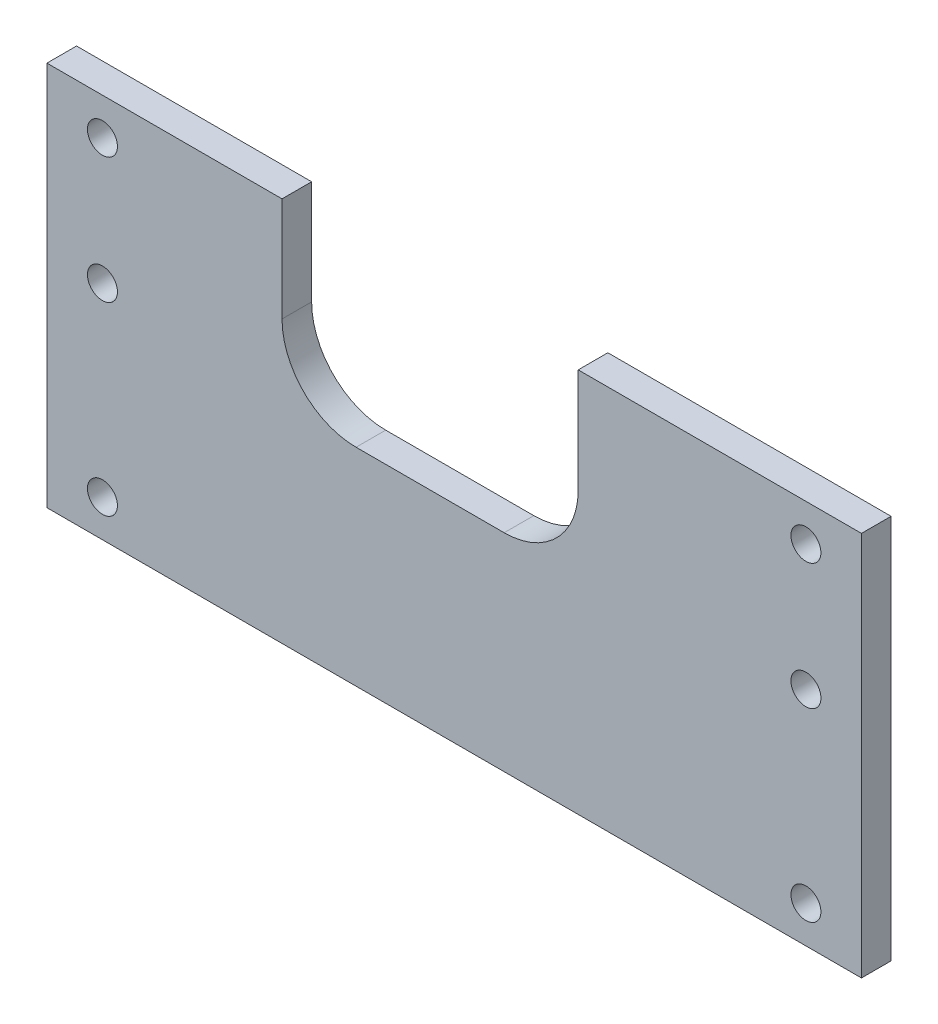
ISO-10303-21;
HEADER;
FILE_DESCRIPTION(('STEP AP214'),'2;1');
FILE_NAME('part.step','',(''),(''),'','','');
FILE_SCHEMA(('AUTOMOTIVE_DESIGN { 1 0 10303 214 1 1 1 1 }'));
ENDSEC;
DATA;
#1=APPLICATION_CONTEXT('core data for automotive mechanical design processes');
#2=APPLICATION_PROTOCOL_DEFINITION('international standard','automotive_design',2000,#1);
#3=PRODUCT_CONTEXT('',#1,'mechanical');
#4=PRODUCT('Part','Part','',(#3));
#5=PRODUCT_RELATED_PRODUCT_CATEGORY('part','',(#4));
#6=PRODUCT_DEFINITION_FORMATION('','',#4);
#7=PRODUCT_DEFINITION_CONTEXT('part definition',#1,'design');
#8=PRODUCT_DEFINITION('design','',#6,#7);
#9=PRODUCT_DEFINITION_SHAPE('','',#8);
#10=(LENGTH_UNIT() NAMED_UNIT(*) SI_UNIT(.MILLI.,.METRE.));
#11=(NAMED_UNIT(*) PLANE_ANGLE_UNIT() SI_UNIT($,.RADIAN.));
#12=(NAMED_UNIT(*) SI_UNIT($,.STERADIAN.) SOLID_ANGLE_UNIT());
#13=UNCERTAINTY_MEASURE_WITH_UNIT(LENGTH_MEASURE(1.E-05),#10,'distance_accuracy_value','');
#14=(GEOMETRIC_REPRESENTATION_CONTEXT(3) GLOBAL_UNCERTAINTY_ASSIGNED_CONTEXT((#13)) GLOBAL_UNIT_ASSIGNED_CONTEXT((#10,
#11,#12)) REPRESENTATION_CONTEXT('',''));
#15=CARTESIAN_POINT('',(0.,0.,0.));
#16=DIRECTION('',(0.,0.,1.));
#17=DIRECTION('',(1.,0.,0.));
#18=AXIS2_PLACEMENT_3D('',#15,#16,#17);
#19=CARTESIAN_POINT('',(-55.,26.,4.));
#20=DIRECTION('',(0.,-1.,0.));
#21=DIRECTION('',(0.,0.,-1.));
#22=AXIS2_PLACEMENT_3D('',#19,#20,#21);
#23=PLANE('',#22);
#24=DIRECTION('',(-1.,0.,0.));
#25=VECTOR('',#24,1.);
#26=CARTESIAN_POINT('',(-55.,26.,4.));
#27=LINE('',#26,#25);
#28=CARTESIAN_POINT('',(-23.2499931858945,26.,4.));
#29=VERTEX_POINT('',#28);
#30=CARTESIAN_POINT('',(-55.,26.,4.));
#31=VERTEX_POINT('',#30);
#32=EDGE_CURVE('E131',#29,#31,#27,.T.);
#33=ORIENTED_EDGE('',*,*,#32,.F.);
#34=DIRECTION('',(0.,0.,-1.));
#35=VECTOR('',#34,1.);
#36=CARTESIAN_POINT('',(-23.2499931858945,26.,4.));
#37=LINE('',#36,#35);
#38=CARTESIAN_POINT('',(-23.2499931858945,26.,0.));
#39=VERTEX_POINT('',#38);
#40=EDGE_CURVE('E124',#29,#39,#37,.T.);
#41=ORIENTED_EDGE('',*,*,#40,.T.);
#42=DIRECTION('',(-1.,0.,0.));
#43=VECTOR('',#42,1.);
#44=CARTESIAN_POINT('',(-55.,26.,0.));
#45=LINE('',#44,#43);
#46=CARTESIAN_POINT('',(-55.,26.,0.));
#47=VERTEX_POINT('',#46);
#48=EDGE_CURVE('E143',#39,#47,#45,.T.);
#49=ORIENTED_EDGE('',*,*,#48,.T.);
#50=DIRECTION('',(0.,0.,-1.));
#51=VECTOR('',#50,1.);
#52=CARTESIAN_POINT('',(-55.,26.,4.));
#53=LINE('',#52,#51);
#54=EDGE_CURVE('E155',#31,#47,#53,.T.);
#55=ORIENTED_EDGE('',*,*,#54,.F.);
#56=EDGE_LOOP('',(#33,#41,#49,#55));
#57=FACE_BOUND('',#56,.T.);
#58=ADVANCED_FACE('F34',(#57),#23,.F.);
#59=CARTESIAN_POINT('',(55.,-26.,4.));
#60=DIRECTION('',(-1.,0.,0.));
#61=DIRECTION('',(0.,0.,1.));
#62=AXIS2_PLACEMENT_3D('',#59,#60,#61);
#63=PLANE('',#62);
#64=DIRECTION('',(0.,1.,0.));
#65=VECTOR('',#64,1.);
#66=CARTESIAN_POINT('',(55.,-26.,0.));
#67=LINE('',#66,#65);
#68=CARTESIAN_POINT('',(55.,-26.,0.));
#69=VERTEX_POINT('',#68);
#70=CARTESIAN_POINT('',(55.,26.,0.));
#71=VERTEX_POINT('',#70);
#72=EDGE_CURVE('E140',#69,#71,#67,.T.);
#73=ORIENTED_EDGE('',*,*,#72,.T.);
#74=DIRECTION('',(0.,0.,-1.));
#75=VECTOR('',#74,1.);
#76=CARTESIAN_POINT('',(55.,26.,4.));
#77=LINE('',#76,#75);
#78=CARTESIAN_POINT('',(55.,26.,4.));
#79=VERTEX_POINT('',#78);
#80=EDGE_CURVE('E158',#79,#71,#77,.T.);
#81=ORIENTED_EDGE('',*,*,#80,.F.);
#82=DIRECTION('',(0.,1.,0.));
#83=VECTOR('',#82,1.);
#84=CARTESIAN_POINT('',(55.,-26.,4.));
#85=LINE('',#84,#83);
#86=CARTESIAN_POINT('',(55.,-26.,4.));
#87=VERTEX_POINT('',#86);
#88=EDGE_CURVE('E128',#87,#79,#85,.T.);
#89=ORIENTED_EDGE('',*,*,#88,.F.);
#90=DIRECTION('',(0.,0.,-1.));
#91=VECTOR('',#90,1.);
#92=CARTESIAN_POINT('',(55.,-26.,4.));
#93=LINE('',#92,#91);
#94=EDGE_CURVE('E139',#87,#69,#93,.T.);
#95=ORIENTED_EDGE('',*,*,#94,.T.);
#96=EDGE_LOOP('',(#73,#81,#89,#95));
#97=FACE_BOUND('',#96,.T.);
#98=ADVANCED_FACE('F255',(#97),#63,.F.);
#99=CARTESIAN_POINT('',(16.7500000000001,26.,0.));
#100=VERTEX_POINT('',#99);
#101=EDGE_CURVE('E123',#71,#100,#45,.T.);
#102=ORIENTED_EDGE('',*,*,#101,.T.);
#103=DIRECTION('',(0.,0.,1.));
#104=VECTOR('',#103,1.);
#105=CARTESIAN_POINT('',(16.7500000000001,26.,4.));
#106=LINE('',#105,#104);
#107=CARTESIAN_POINT('',(16.7500000000001,26.,4.));
#108=VERTEX_POINT('',#107);
#109=EDGE_CURVE('E110',#100,#108,#106,.T.);
#110=ORIENTED_EDGE('',*,*,#109,.T.);
#111=EDGE_CURVE('E121',#79,#108,#27,.T.);
#112=ORIENTED_EDGE('',*,*,#111,.F.);
#113=ORIENTED_EDGE('',*,*,#80,.T.);
#114=EDGE_LOOP('',(#102,#110,#112,#113));
#115=FACE_BOUND('',#114,.T.);
#116=ADVANCED_FACE('F119',(#115),#23,.F.);
#117=CARTESIAN_POINT('',(-55.,-26.,4.));
#118=DIRECTION('',(1.,0.,0.));
#119=DIRECTION('',(0.,0.,-1.));
#120=AXIS2_PLACEMENT_3D('',#117,#118,#119);
#121=PLANE('',#120);
#122=DIRECTION('',(0.,-1.,0.));
#123=VECTOR('',#122,1.);
#124=CARTESIAN_POINT('',(-55.,-26.,0.));
#125=LINE('',#124,#123);
#126=CARTESIAN_POINT('',(-55.,-26.,0.));
#127=VERTEX_POINT('',#126);
#128=EDGE_CURVE('E146',#47,#127,#125,.T.);
#129=ORIENTED_EDGE('',*,*,#128,.T.);
#130=DIRECTION('',(0.,0.,-1.));
#131=VECTOR('',#130,1.);
#132=CARTESIAN_POINT('',(-55.,-26.,4.));
#133=LINE('',#132,#131);
#134=CARTESIAN_POINT('',(-55.,-26.,4.));
#135=VERTEX_POINT('',#134);
#136=EDGE_CURVE('E152',#135,#127,#133,.T.);
#137=ORIENTED_EDGE('',*,*,#136,.F.);
#138=DIRECTION('',(0.,-1.,0.));
#139=VECTOR('',#138,1.);
#140=CARTESIAN_POINT('',(-55.,-26.,4.));
#141=LINE('',#140,#139);
#142=EDGE_CURVE('E130',#31,#135,#141,.T.);
#143=ORIENTED_EDGE('',*,*,#142,.F.);
#144=ORIENTED_EDGE('',*,*,#54,.T.);
#145=EDGE_LOOP('',(#129,#137,#143,#144));
#146=FACE_BOUND('',#145,.T.);
#147=ADVANCED_FACE('F266',(#146),#121,.F.);
#148=CARTESIAN_POINT('',(-55.,-26.,4.));
#149=DIRECTION('',(0.,1.,0.));
#150=DIRECTION('',(0.,0.,1.));
#151=AXIS2_PLACEMENT_3D('',#148,#149,#150);
#152=PLANE('',#151);
#153=DIRECTION('',(1.,0.,0.));
#154=VECTOR('',#153,1.);
#155=CARTESIAN_POINT('',(-55.,-26.,0.));
#156=LINE('',#155,#154);
#157=EDGE_CURVE('E148',#127,#69,#156,.T.);
#158=ORIENTED_EDGE('',*,*,#157,.T.);
#159=ORIENTED_EDGE('',*,*,#94,.F.);
#160=DIRECTION('',(1.,0.,0.));
#161=VECTOR('',#160,1.);
#162=CARTESIAN_POINT('',(-55.,-26.,4.));
#163=LINE('',#162,#161);
#164=EDGE_CURVE('E133',#135,#87,#163,.T.);
#165=ORIENTED_EDGE('',*,*,#164,.F.);
#166=ORIENTED_EDGE('',*,*,#136,.T.);
#167=EDGE_LOOP('',(#158,#159,#165,#166));
#168=FACE_BOUND('',#167,.T.);
#169=ADVANCED_FACE('F250',(#168),#152,.F.);
#170=CARTESIAN_POINT('',(0.,0.,4.));
#171=DIRECTION('',(0.,0.,-1.));
#172=DIRECTION('',(-1.,0.,0.));
#173=AXIS2_PLACEMENT_3D('',#170,#171,#172);
#174=PLANE('',#173);
#175=CARTESIAN_POINT('',(-47.5,21.0000000000086,4.));
#176=DIRECTION('',(0.,0.,-1.));
#177=DIRECTION('',(1.,0.,0.));
#178=AXIS2_PLACEMENT_3D('',#175,#176,#177);
#179=CIRCLE('',#178,2.025);
#180=CARTESIAN_POINT('',(-45.475,21.0000000000086,4.));
#181=VERTEX_POINT('',#180);
#182=EDGE_CURVE('E229',#181,#181,#179,.T.);
#183=ORIENTED_EDGE('',*,*,#182,.T.);
#184=EDGE_LOOP('',(#183));
#185=FACE_BOUND('',#184,.T.);
#186=CARTESIAN_POINT('',(-47.5,4.00000000000361,4.));
#187=DIRECTION('',(0.,0.,-1.));
#188=DIRECTION('',(1.,0.,0.));
#189=AXIS2_PLACEMENT_3D('',#186,#187,#188);
#190=CIRCLE('',#189,2.025);
#191=CARTESIAN_POINT('',(-45.475,4.00000000000361,4.));
#192=VERTEX_POINT('',#191);
#193=EDGE_CURVE('E223',#192,#192,#190,.T.);
#194=ORIENTED_EDGE('',*,*,#193,.T.);
#195=EDGE_LOOP('',(#194));
#196=FACE_BOUND('',#195,.T.);
#197=CARTESIAN_POINT('',(-47.5,-21.0000000000014,4.));
#198=DIRECTION('',(0.,0.,-1.));
#199=DIRECTION('',(1.,0.,0.));
#200=AXIS2_PLACEMENT_3D('',#197,#198,#199);
#201=CIRCLE('',#200,2.025);
#202=CARTESIAN_POINT('',(-45.475,-21.0000000000014,4.));
#203=VERTEX_POINT('',#202);
#204=EDGE_CURVE('E217',#203,#203,#201,.T.);
#205=ORIENTED_EDGE('',*,*,#204,.T.);
#206=EDGE_LOOP('',(#205));
#207=FACE_BOUND('',#206,.T.);
#208=CARTESIAN_POINT('',(47.5,-21.0000000000014,4.));
#209=DIRECTION('',(0.,0.,-1.));
#210=DIRECTION('',(-1.,0.,0.));
#211=AXIS2_PLACEMENT_3D('',#208,#209,#210);
#212=CIRCLE('',#211,2.025);
#213=CARTESIAN_POINT('',(45.475,-21.0000000000014,4.));
#214=VERTEX_POINT('',#213);
#215=EDGE_CURVE('E211',#214,#214,#212,.T.);
#216=ORIENTED_EDGE('',*,*,#215,.T.);
#217=EDGE_LOOP('',(#216));
#218=FACE_BOUND('',#217,.T.);
#219=CARTESIAN_POINT('',(47.5,4.00000000000361,4.));
#220=DIRECTION('',(0.,0.,-1.));
#221=DIRECTION('',(-1.,0.,0.));
#222=AXIS2_PLACEMENT_3D('',#219,#220,#221);
#223=CIRCLE('',#222,2.025);
#224=CARTESIAN_POINT('',(45.475,4.00000000000361,4.));
#225=VERTEX_POINT('',#224);
#226=EDGE_CURVE('E204',#225,#225,#223,.T.);
#227=ORIENTED_EDGE('',*,*,#226,.T.);
#228=EDGE_LOOP('',(#227));
#229=FACE_BOUND('',#228,.T.);
#230=CARTESIAN_POINT('',(47.5,21.0000000000086,4.));
#231=DIRECTION('',(0.,0.,-1.));
#232=DIRECTION('',(-1.,0.,0.));
#233=AXIS2_PLACEMENT_3D('',#230,#231,#232);
#234=CIRCLE('',#233,2.025);
#235=CARTESIAN_POINT('',(45.475,21.0000000000086,4.));
#236=VERTEX_POINT('',#235);
#237=EDGE_CURVE('E144',#236,#236,#234,.T.);
#238=ORIENTED_EDGE('',*,*,#237,.T.);
#239=EDGE_LOOP('',(#238));
#240=FACE_BOUND('',#239,.T.);
#241=DIRECTION('',(0.,-1.,0.));
#242=VECTOR('',#241,1.);
#243=CARTESIAN_POINT('',(16.7500000000001,1.94999999999883,4.));
#244=LINE('',#243,#242);
#245=CARTESIAN_POINT('',(16.7500000000001,11.9499999999988,4.));
#246=VERTEX_POINT('',#245);
#247=EDGE_CURVE('E107',#108,#246,#244,.T.);
#248=ORIENTED_EDGE('',*,*,#247,.T.);
#249=CARTESIAN_POINT('',(6.75000000000007,11.9499999999988,4.));
#250=DIRECTION('',(0.,0.,-1.));
#251=DIRECTION('',(-1.,0.,0.));
#252=AXIS2_PLACEMENT_3D('',#249,#250,#251);
#253=CIRCLE('',#252,10.);
#254=CARTESIAN_POINT('',(6.75000000000007,1.94999999999883,4.));
#255=VERTEX_POINT('',#254);
#256=EDGE_CURVE('E11',#246,#255,#253,.T.);
#257=ORIENTED_EDGE('',*,*,#256,.T.);
#258=DIRECTION('',(-1.,0.,0.));
#259=VECTOR('',#258,1.);
#260=CARTESIAN_POINT('',(16.7500000000001,1.94999999999883,4.));
#261=LINE('',#260,#259);
#262=CARTESIAN_POINT('',(-13.2499931858945,1.94999999999883,4.));
#263=VERTEX_POINT('',#262);
#264=EDGE_CURVE('E114',#255,#263,#261,.T.);
#265=ORIENTED_EDGE('',*,*,#264,.T.);
#266=CARTESIAN_POINT('',(-13.2499931858945,11.9499999999988,4.));
#267=DIRECTION('',(0.,0.,-1.));
#268=DIRECTION('',(-1.,0.,0.));
#269=AXIS2_PLACEMENT_3D('',#266,#267,#268);
#270=CIRCLE('',#269,10.);
#271=CARTESIAN_POINT('',(-23.2499931858945,11.9499999999988,4.));
#272=VERTEX_POINT('',#271);
#273=EDGE_CURVE('E173',#263,#272,#270,.T.);
#274=ORIENTED_EDGE('',*,*,#273,.T.);
#275=DIRECTION('',(0.,1.,0.));
#276=VECTOR('',#275,1.);
#277=CARTESIAN_POINT('',(-23.2499931858945,1.94999999999883,4.));
#278=LINE('',#277,#276);
#279=EDGE_CURVE('E115',#272,#29,#278,.T.);
#280=ORIENTED_EDGE('',*,*,#279,.T.);
#281=ORIENTED_EDGE('',*,*,#32,.T.);
#282=ORIENTED_EDGE('',*,*,#142,.T.);
#283=ORIENTED_EDGE('',*,*,#164,.T.);
#284=ORIENTED_EDGE('',*,*,#88,.T.);
#285=ORIENTED_EDGE('',*,*,#111,.T.);
#286=EDGE_LOOP('',(#248,#257,#265,#274,#280,#281,#282,#283,#284,#285));
#287=FACE_BOUND('',#286,.T.);
#288=ADVANCED_FACE('F126',(#185,#196,#207,#218,#229,#240,#287),#174,.F.);
#289=CARTESIAN_POINT('',(0.,0.,0.));
#290=DIRECTION('',(0.,0.,-1.));
#291=DIRECTION('',(-1.,0.,0.));
#292=AXIS2_PLACEMENT_3D('',#289,#290,#291);
#293=PLANE('',#292);
#294=DIRECTION('',(0.,1.,0.));
#295=VECTOR('',#294,1.);
#296=CARTESIAN_POINT('',(-23.2499931858945,1.94999999999883,0.));
#297=LINE('',#296,#295);
#298=CARTESIAN_POINT('',(-23.2499931858945,11.9499999999988,0.));
#299=VERTEX_POINT('',#298);
#300=EDGE_CURVE('E194',#299,#39,#297,.T.);
#301=ORIENTED_EDGE('',*,*,#300,.F.);
#302=CARTESIAN_POINT('',(-13.2499931858945,11.9499999999988,0.));
#303=DIRECTION('',(0.,0.,-1.));
#304=DIRECTION('',(-1.,0.,0.));
#305=AXIS2_PLACEMENT_3D('',#302,#303,#304);
#306=CIRCLE('',#305,10.);
#307=CARTESIAN_POINT('',(-13.2499931858945,1.94999999999883,0.));
#308=VERTEX_POINT('',#307);
#309=EDGE_CURVE('E171',#299,#308,#306,.F.);
#310=ORIENTED_EDGE('',*,*,#309,.T.);
#311=DIRECTION('',(-1.,0.,0.));
#312=VECTOR('',#311,1.);
#313=CARTESIAN_POINT('',(16.7500000000001,1.94999999999883,0.));
#314=LINE('',#313,#312);
#315=CARTESIAN_POINT('',(6.75000000000007,1.94999999999883,0.));
#316=VERTEX_POINT('',#315);
#317=EDGE_CURVE('E187',#316,#308,#314,.T.);
#318=ORIENTED_EDGE('',*,*,#317,.F.);
#319=CARTESIAN_POINT('',(6.75000000000007,11.9499999999988,0.));
#320=DIRECTION('',(0.,0.,-1.));
#321=DIRECTION('',(-1.,0.,0.));
#322=AXIS2_PLACEMENT_3D('',#319,#320,#321);
#323=CIRCLE('',#322,10.);
#324=CARTESIAN_POINT('',(16.7500000000001,11.9499999999988,0.));
#325=VERTEX_POINT('',#324);
#326=EDGE_CURVE('E42',#316,#325,#323,.F.);
#327=ORIENTED_EDGE('',*,*,#326,.T.);
#328=DIRECTION('',(0.,-1.,0.));
#329=VECTOR('',#328,1.);
#330=CARTESIAN_POINT('',(16.7500000000001,0.,0.));
#331=LINE('',#330,#329);
#332=EDGE_CURVE('E160',#100,#325,#331,.T.);
#333=ORIENTED_EDGE('',*,*,#332,.F.);
#334=ORIENTED_EDGE('',*,*,#101,.F.);
#335=ORIENTED_EDGE('',*,*,#72,.F.);
#336=ORIENTED_EDGE('',*,*,#157,.F.);
#337=ORIENTED_EDGE('',*,*,#128,.F.);
#338=ORIENTED_EDGE('',*,*,#48,.F.);
#339=EDGE_LOOP('',(#301,#310,#318,#327,#333,#334,#335,#336,#337,#338));
#340=FACE_BOUND('',#339,.T.);
#341=CARTESIAN_POINT('',(-47.5,21.0000000000086,0.));
#342=DIRECTION('',(0.,0.,-1.));
#343=DIRECTION('',(1.,0.,0.));
#344=AXIS2_PLACEMENT_3D('',#341,#342,#343);
#345=CIRCLE('',#344,2.025);
#346=CARTESIAN_POINT('',(-45.475,21.0000000000086,0.));
#347=VERTEX_POINT('',#346);
#348=EDGE_CURVE('E203',#347,#347,#345,.T.);
#349=ORIENTED_EDGE('',*,*,#348,.F.);
#350=EDGE_LOOP('',(#349));
#351=FACE_BOUND('',#350,.T.);
#352=CARTESIAN_POINT('',(-47.5,4.00000000000361,0.));
#353=DIRECTION('',(0.,0.,-1.));
#354=DIRECTION('',(1.,0.,0.));
#355=AXIS2_PLACEMENT_3D('',#352,#353,#354);
#356=CIRCLE('',#355,2.025);
#357=CARTESIAN_POINT('',(-45.475,4.00000000000361,0.));
#358=VERTEX_POINT('',#357);
#359=EDGE_CURVE('E226',#358,#358,#356,.T.);
#360=ORIENTED_EDGE('',*,*,#359,.F.);
#361=EDGE_LOOP('',(#360));
#362=FACE_BOUND('',#361,.T.);
#363=CARTESIAN_POINT('',(-47.5,-21.0000000000014,0.));
#364=DIRECTION('',(0.,0.,-1.));
#365=DIRECTION('',(1.,0.,0.));
#366=AXIS2_PLACEMENT_3D('',#363,#364,#365);
#367=CIRCLE('',#366,2.025);
#368=CARTESIAN_POINT('',(-45.475,-21.0000000000014,0.));
#369=VERTEX_POINT('',#368);
#370=EDGE_CURVE('E220',#369,#369,#367,.T.);
#371=ORIENTED_EDGE('',*,*,#370,.F.);
#372=EDGE_LOOP('',(#371));
#373=FACE_BOUND('',#372,.T.);
#374=CARTESIAN_POINT('',(47.5,-21.0000000000014,0.));
#375=DIRECTION('',(0.,0.,-1.));
#376=DIRECTION('',(-1.,0.,0.));
#377=AXIS2_PLACEMENT_3D('',#374,#375,#376);
#378=CIRCLE('',#377,2.025);
#379=CARTESIAN_POINT('',(45.475,-21.0000000000014,0.));
#380=VERTEX_POINT('',#379);
#381=EDGE_CURVE('E214',#380,#380,#378,.T.);
#382=ORIENTED_EDGE('',*,*,#381,.F.);
#383=EDGE_LOOP('',(#382));
#384=FACE_BOUND('',#383,.T.);
#385=CARTESIAN_POINT('',(47.5,4.00000000000361,0.));
#386=DIRECTION('',(0.,0.,-1.));
#387=DIRECTION('',(-1.,0.,0.));
#388=AXIS2_PLACEMENT_3D('',#385,#386,#387);
#389=CIRCLE('',#388,2.025);
#390=CARTESIAN_POINT('',(45.475,4.00000000000361,0.));
#391=VERTEX_POINT('',#390);
#392=EDGE_CURVE('E208',#391,#391,#389,.T.);
#393=ORIENTED_EDGE('',*,*,#392,.F.);
#394=EDGE_LOOP('',(#393));
#395=FACE_BOUND('',#394,.T.);
#396=CARTESIAN_POINT('',(47.5,21.0000000000086,0.));
#397=DIRECTION('',(0.,0.,-1.));
#398=DIRECTION('',(-1.,0.,0.));
#399=AXIS2_PLACEMENT_3D('',#396,#397,#398);
#400=CIRCLE('',#399,2.025);
#401=CARTESIAN_POINT('',(45.475,21.0000000000086,0.));
#402=VERTEX_POINT('',#401);
#403=EDGE_CURVE('E207',#402,#402,#400,.T.);
#404=ORIENTED_EDGE('',*,*,#403,.F.);
#405=EDGE_LOOP('',(#404));
#406=FACE_BOUND('',#405,.T.);
#407=ADVANCED_FACE('F191',(#340,#351,#362,#373,#384,#395,#406),#293,.T.);
#408=CARTESIAN_POINT('',(47.5,21.0000000000086,4.));
#409=DIRECTION('',(0.,0.,-1.));
#410=DIRECTION('',(-1.,0.,0.));
#411=AXIS2_PLACEMENT_3D('',#408,#409,#410);
#412=CYLINDRICAL_SURFACE('',#411,2.025);
#413=ORIENTED_EDGE('',*,*,#237,.F.);
#414=EDGE_LOOP('',(#413));
#415=FACE_BOUND('',#414,.T.);
#416=ORIENTED_EDGE('',*,*,#403,.T.);
#417=EDGE_LOOP('',(#416));
#418=FACE_BOUND('',#417,.T.);
#419=ADVANCED_FACE('F238',(#415,#418),#412,.F.);
#420=CARTESIAN_POINT('',(47.5,4.00000000000361,4.));
#421=DIRECTION('',(0.,0.,-1.));
#422=DIRECTION('',(-1.,0.,0.));
#423=AXIS2_PLACEMENT_3D('',#420,#421,#422);
#424=CYLINDRICAL_SURFACE('',#423,2.025);
#425=ORIENTED_EDGE('',*,*,#226,.F.);
#426=EDGE_LOOP('',(#425));
#427=FACE_BOUND('',#426,.T.);
#428=ORIENTED_EDGE('',*,*,#392,.T.);
#429=EDGE_LOOP('',(#428));
#430=FACE_BOUND('',#429,.T.);
#431=ADVANCED_FACE('F247',(#427,#430),#424,.F.);
#432=CARTESIAN_POINT('',(47.5,-21.0000000000014,4.));
#433=DIRECTION('',(0.,0.,-1.));
#434=DIRECTION('',(-1.,0.,0.));
#435=AXIS2_PLACEMENT_3D('',#432,#433,#434);
#436=CYLINDRICAL_SURFACE('',#435,2.025);
#437=ORIENTED_EDGE('',*,*,#215,.F.);
#438=EDGE_LOOP('',(#437));
#439=FACE_BOUND('',#438,.T.);
#440=ORIENTED_EDGE('',*,*,#381,.T.);
#441=EDGE_LOOP('',(#440));
#442=FACE_BOUND('',#441,.T.);
#443=ADVANCED_FACE('F302',(#439,#442),#436,.F.);
#444=CARTESIAN_POINT('',(-47.5,-21.0000000000014,4.));
#445=DIRECTION('',(0.,0.,-1.));
#446=DIRECTION('',(-1.,0.,0.));
#447=AXIS2_PLACEMENT_3D('',#444,#445,#446);
#448=CYLINDRICAL_SURFACE('',#447,2.025);
#449=ORIENTED_EDGE('',*,*,#204,.F.);
#450=EDGE_LOOP('',(#449));
#451=FACE_BOUND('',#450,.T.);
#452=ORIENTED_EDGE('',*,*,#370,.T.);
#453=EDGE_LOOP('',(#452));
#454=FACE_BOUND('',#453,.T.);
#455=ADVANCED_FACE('F306',(#451,#454),#448,.F.);
#456=CARTESIAN_POINT('',(-47.5,4.00000000000361,4.));
#457=DIRECTION('',(0.,0.,-1.));
#458=DIRECTION('',(-1.,0.,0.));
#459=AXIS2_PLACEMENT_3D('',#456,#457,#458);
#460=CYLINDRICAL_SURFACE('',#459,2.025);
#461=ORIENTED_EDGE('',*,*,#193,.F.);
#462=EDGE_LOOP('',(#461));
#463=FACE_BOUND('',#462,.T.);
#464=ORIENTED_EDGE('',*,*,#359,.T.);
#465=EDGE_LOOP('',(#464));
#466=FACE_BOUND('',#465,.T.);
#467=ADVANCED_FACE('F310',(#463,#466),#460,.F.);
#468=CARTESIAN_POINT('',(-47.5,21.0000000000086,4.));
#469=DIRECTION('',(0.,0.,-1.));
#470=DIRECTION('',(-1.,0.,0.));
#471=AXIS2_PLACEMENT_3D('',#468,#469,#470);
#472=CYLINDRICAL_SURFACE('',#471,2.025);
#473=ORIENTED_EDGE('',*,*,#182,.F.);
#474=EDGE_LOOP('',(#473));
#475=FACE_BOUND('',#474,.T.);
#476=ORIENTED_EDGE('',*,*,#348,.T.);
#477=EDGE_LOOP('',(#476));
#478=FACE_BOUND('',#477,.T.);
#479=ADVANCED_FACE('F299',(#475,#478),#472,.F.);
#480=CARTESIAN_POINT('',(-23.2499931858945,1.94999999999883,4.));
#481=DIRECTION('',(-1.,0.,0.));
#482=DIRECTION('',(0.,0.,1.));
#483=AXIS2_PLACEMENT_3D('',#480,#481,#482);
#484=PLANE('',#483);
#485=ORIENTED_EDGE('',*,*,#279,.F.);
#486=DIRECTION('',(0.,0.,-1.));
#487=VECTOR('',#486,1.);
#488=CARTESIAN_POINT('',(-23.2499931858945,11.9499999999988,0.));
#489=LINE('',#488,#487);
#490=EDGE_CURVE('E162',#272,#299,#489,.T.);
#491=ORIENTED_EDGE('',*,*,#490,.T.);
#492=ORIENTED_EDGE('',*,*,#300,.T.);
#493=ORIENTED_EDGE('',*,*,#40,.F.);
#494=EDGE_LOOP('',(#485,#491,#492,#493));
#495=FACE_BOUND('',#494,.T.);
#496=ADVANCED_FACE('F183',(#495),#484,.F.);
#497=CARTESIAN_POINT('',(16.7500000000001,1.94999999999883,4.));
#498=DIRECTION('',(1.,0.,0.));
#499=DIRECTION('',(0.,0.,-1.));
#500=AXIS2_PLACEMENT_3D('',#497,#498,#499);
#501=PLANE('',#500);
#502=ORIENTED_EDGE('',*,*,#332,.T.);
#503=DIRECTION('',(0.,0.,-1.));
#504=VECTOR('',#503,1.);
#505=CARTESIAN_POINT('',(16.7500000000001,11.9499999999988,4.));
#506=LINE('',#505,#504);
#507=EDGE_CURVE('E49',#325,#246,#506,.F.);
#508=ORIENTED_EDGE('',*,*,#507,.T.);
#509=ORIENTED_EDGE('',*,*,#247,.F.);
#510=ORIENTED_EDGE('',*,*,#109,.F.);
#511=EDGE_LOOP('',(#502,#508,#509,#510));
#512=FACE_BOUND('',#511,.T.);
#513=ADVANCED_FACE('F109',(#512),#501,.F.);
#514=CARTESIAN_POINT('',(16.7500000000001,1.94999999999883,4.));
#515=DIRECTION('',(0.,-1.,0.));
#516=DIRECTION('',(0.,0.,-1.));
#517=AXIS2_PLACEMENT_3D('',#514,#515,#516);
#518=PLANE('',#517);
#519=ORIENTED_EDGE('',*,*,#317,.T.);
#520=DIRECTION('',(0.,0.,-1.));
#521=VECTOR('',#520,1.);
#522=CARTESIAN_POINT('',(-13.2499931858945,1.94999999999883,4.));
#523=LINE('',#522,#521);
#524=EDGE_CURVE('E168',#308,#263,#523,.F.);
#525=ORIENTED_EDGE('',*,*,#524,.T.);
#526=ORIENTED_EDGE('',*,*,#264,.F.);
#527=DIRECTION('',(0.,0.,-1.));
#528=VECTOR('',#527,1.);
#529=CARTESIAN_POINT('',(6.75000000000007,1.94999999999883,0.));
#530=LINE('',#529,#528);
#531=EDGE_CURVE('E165',#255,#316,#530,.T.);
#532=ORIENTED_EDGE('',*,*,#531,.T.);
#533=EDGE_LOOP('',(#519,#525,#526,#532));
#534=FACE_BOUND('',#533,.T.);
#535=ADVANCED_FACE('F196',(#534),#518,.F.);
#536=CARTESIAN_POINT('',(-13.2499931858945,11.9499999999988,4.));
#537=DIRECTION('',(0.,0.,1.));
#538=DIRECTION('',(1.,0.,0.));
#539=AXIS2_PLACEMENT_3D('',#536,#537,#538);
#540=CYLINDRICAL_SURFACE('',#539,10.);
#541=ORIENTED_EDGE('',*,*,#273,.F.);
#542=ORIENTED_EDGE('',*,*,#524,.F.);
#543=ORIENTED_EDGE('',*,*,#309,.F.);
#544=ORIENTED_EDGE('',*,*,#490,.F.);
#545=EDGE_LOOP('',(#541,#542,#543,#544));
#546=FACE_BOUND('',#545,.T.);
#547=ADVANCED_FACE('F189',(#546),#540,.F.);
#548=CARTESIAN_POINT('',(6.75000000000007,11.9499999999988,4.));
#549=DIRECTION('',(0.,0.,1.));
#550=DIRECTION('',(1.,0.,0.));
#551=AXIS2_PLACEMENT_3D('',#548,#549,#550);
#552=CYLINDRICAL_SURFACE('',#551,10.);
#553=ORIENTED_EDGE('',*,*,#256,.F.);
#554=ORIENTED_EDGE('',*,*,#507,.F.);
#555=ORIENTED_EDGE('',*,*,#326,.F.);
#556=ORIENTED_EDGE('',*,*,#531,.F.);
#557=EDGE_LOOP('',(#553,#554,#555,#556));
#558=FACE_BOUND('',#557,.T.);
#559=ADVANCED_FACE('F36',(#558),#552,.F.);
#560=CLOSED_SHELL('',(#58,#98,#116,#147,#169,#288,#407,#419,#431,#443,#455,#467,#479,#496,#513,
#535,#547,#559));
#561=MANIFOLD_SOLID_BREP('B2',#560);
#562=ADVANCED_BREP_SHAPE_REPRESENTATION('',(#18,#561),#14);
#563=SHAPE_DEFINITION_REPRESENTATION(#9,#562);
ENDSEC;
END-ISO-10303-21;
